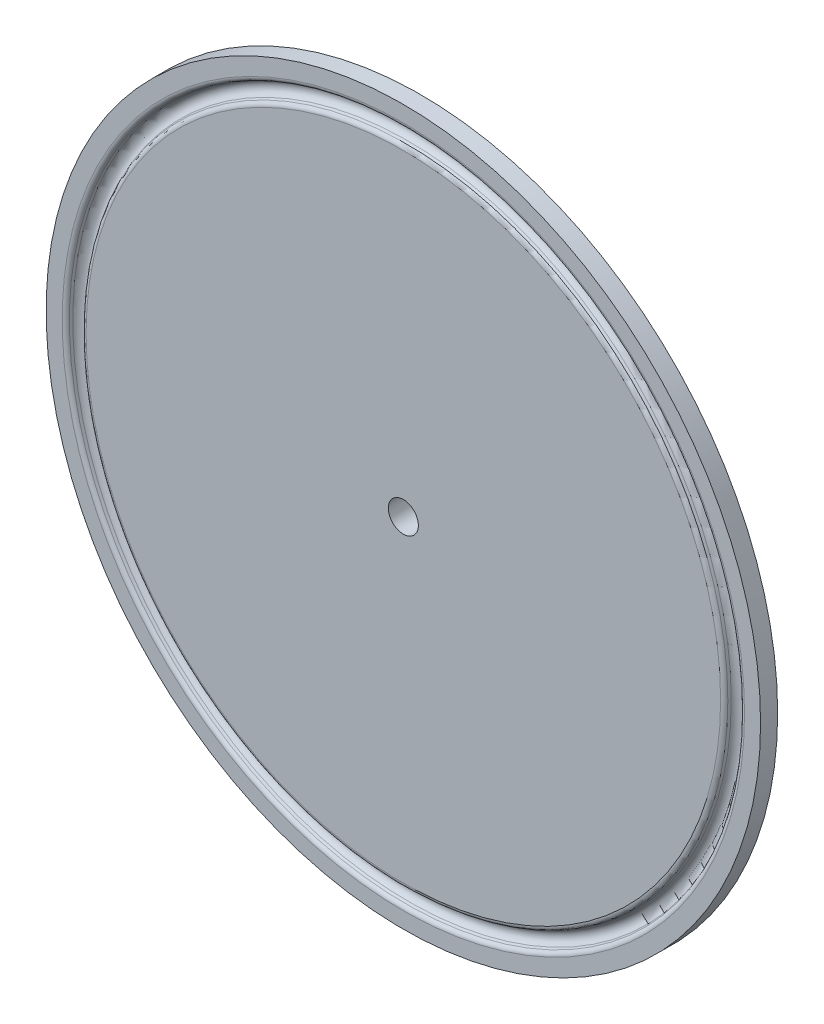
ISO-10303-21;
HEADER;
FILE_DESCRIPTION(('STEP AP214'),'2;1');
FILE_NAME('part.step','',(''),(''),'','','');
FILE_SCHEMA(('AUTOMOTIVE_DESIGN { 1 0 10303 214 1 1 1 1 }'));
ENDSEC;
DATA;
#1=APPLICATION_CONTEXT('core data for automotive mechanical design processes');
#2=APPLICATION_PROTOCOL_DEFINITION('international standard','automotive_design',2000,#1);
#3=PRODUCT_CONTEXT('',#1,'mechanical');
#4=PRODUCT('Part','Part','',(#3));
#5=PRODUCT_RELATED_PRODUCT_CATEGORY('part','',(#4));
#6=PRODUCT_DEFINITION_FORMATION('','',#4);
#7=PRODUCT_DEFINITION_CONTEXT('part definition',#1,'design');
#8=PRODUCT_DEFINITION('design','',#6,#7);
#9=PRODUCT_DEFINITION_SHAPE('','',#8);
#10=(LENGTH_UNIT() NAMED_UNIT(*) SI_UNIT(.MILLI.,.METRE.));
#11=(NAMED_UNIT(*) PLANE_ANGLE_UNIT() SI_UNIT($,.RADIAN.));
#12=(NAMED_UNIT(*) SI_UNIT($,.STERADIAN.) SOLID_ANGLE_UNIT());
#13=UNCERTAINTY_MEASURE_WITH_UNIT(LENGTH_MEASURE(1.E-05),#10,'distance_accuracy_value','');
#14=(GEOMETRIC_REPRESENTATION_CONTEXT(3) GLOBAL_UNCERTAINTY_ASSIGNED_CONTEXT((#13)) GLOBAL_UNIT_ASSIGNED_CONTEXT((#10,
#11,#12)) REPRESENTATION_CONTEXT('',''));
#15=CARTESIAN_POINT('',(0.,0.,0.));
#16=DIRECTION('',(0.,0.,1.));
#17=DIRECTION('',(1.,0.,0.));
#18=AXIS2_PLACEMENT_3D('',#15,#16,#17);
#19=CARTESIAN_POINT('',(0.,45.5042147091706,-7.9248));
#20=DIRECTION('',(0.,0.,1.));
#21=DIRECTION('',(1.,0.,0.));
#22=AXIS2_PLACEMENT_3D('',#19,#20,#21);
#23=PLANE('',#22);
#24=CARTESIAN_POINT('',(0.,0.,-7.9248));
#25=DIRECTION('',(0.,0.,1.));
#26=DIRECTION('',(1.,0.,0.));
#27=AXIS2_PLACEMENT_3D('',#24,#25,#26);
#28=CIRCLE('',#27,5.5);
#29=CARTESIAN_POINT('',(5.5,0.,-7.9248));
#30=VERTEX_POINT('',#29);
#31=EDGE_CURVE('E10',#30,#30,#28,.T.);
#32=ORIENTED_EDGE('',*,*,#31,.T.);
#33=EDGE_LOOP('',(#32));
#34=FACE_BOUND('',#33,.T.);
#35=CARTESIAN_POINT('',(0.,0.,-7.9248));
#36=DIRECTION('',(0.,0.,1.));
#37=DIRECTION('',(1.,0.,0.));
#38=AXIS2_PLACEMENT_3D('',#35,#36,#37);
#39=CIRCLE('',#38,45.5042147091706);
#40=CARTESIAN_POINT('',(45.5042147091706,0.,-7.9248));
#41=VERTEX_POINT('',#40);
#42=EDGE_CURVE('E54',#41,#41,#39,.T.);
#43=ORIENTED_EDGE('',*,*,#42,.F.);
#44=EDGE_LOOP('',(#43));
#45=FACE_BOUND('',#44,.T.);
#46=ADVANCED_FACE('F41',(#34,#45),#23,.F.);
#47=CARTESIAN_POINT('',(0.,0.,-7.9248));
#48=DIRECTION('',(0.,0.,1.));
#49=DIRECTION('',(1.,0.,0.));
#50=AXIS2_PLACEMENT_3D('',#47,#48,#49);
#51=CONICAL_SURFACE('',#50,45.5042147091706,1.22173047639603);
#52=CARTESIAN_POINT('',(0.,0.,-2.8448));
#53=DIRECTION('',(0.,0.,1.));
#54=DIRECTION('',(1.,0.,0.));
#55=AXIS2_PLACEMENT_3D('',#52,#53,#54);
#56=CIRCLE('',#55,59.4614);
#57=CARTESIAN_POINT('',(59.4614,0.,-2.8448));
#58=VERTEX_POINT('',#57);
#59=EDGE_CURVE('E59',#58,#58,#56,.T.);
#60=ORIENTED_EDGE('',*,*,#59,.F.);
#61=EDGE_LOOP('',(#60));
#62=FACE_BOUND('',#61,.T.);
#63=ORIENTED_EDGE('',*,*,#42,.T.);
#64=EDGE_LOOP('',(#63));
#65=FACE_BOUND('',#64,.T.);
#66=ADVANCED_FACE('F123',(#62,#65),#51,.T.);
#67=CARTESIAN_POINT('',(0.,0.,0.));
#68=DIRECTION('',(0.,0.,1.));
#69=DIRECTION('',(1.,0.,0.));
#70=AXIS2_PLACEMENT_3D('',#67,#68,#69);
#71=CYLINDRICAL_SURFACE('',#70,59.4614);
#72=CARTESIAN_POINT('',(0.,0.,0.));
#73=DIRECTION('',(0.,0.,1.));
#74=DIRECTION('',(1.,0.,0.));
#75=AXIS2_PLACEMENT_3D('',#72,#73,#74);
#76=CIRCLE('',#75,59.4614);
#77=CARTESIAN_POINT('',(59.4614,0.,0.));
#78=VERTEX_POINT('',#77);
#79=EDGE_CURVE('E65',#78,#78,#76,.T.);
#80=ORIENTED_EDGE('',*,*,#79,.F.);
#81=EDGE_LOOP('',(#80));
#82=FACE_BOUND('',#81,.T.);
#83=ORIENTED_EDGE('',*,*,#59,.T.);
#84=EDGE_LOOP('',(#83));
#85=FACE_BOUND('',#84,.T.);
#86=ADVANCED_FACE('F127',(#82,#85),#71,.T.);
#87=CARTESIAN_POINT('',(0.,56.7910722747395,0.));
#88=DIRECTION('',(0.,0.,-1.));
#89=DIRECTION('',(-1.,0.,0.));
#90=AXIS2_PLACEMENT_3D('',#87,#88,#89);
#91=PLANE('',#90);
#92=CARTESIAN_POINT('',(0.,0.,0.));
#93=DIRECTION('',(0.,0.,1.));
#94=DIRECTION('',(1.,0.,0.));
#95=AXIS2_PLACEMENT_3D('',#92,#93,#94);
#96=CIRCLE('',#95,56.7910722747395);
#97=CARTESIAN_POINT('',(56.7910722747395,0.,0.));
#98=VERTEX_POINT('',#97);
#99=EDGE_CURVE('E69',#98,#98,#96,.T.);
#100=ORIENTED_EDGE('',*,*,#99,.F.);
#101=EDGE_LOOP('',(#100));
#102=FACE_BOUND('',#101,.T.);
#103=ORIENTED_EDGE('',*,*,#79,.T.);
#104=EDGE_LOOP('',(#103));
#105=FACE_BOUND('',#104,.T.);
#106=ADVANCED_FACE('F134',(#102,#105),#91,.F.);
#107=CARTESIAN_POINT('',(0.,0.,-0.7874));
#108=DIRECTION('',(0.,0.,1.));
#109=DIRECTION('',(1.,0.,0.));
#110=AXIS2_PLACEMENT_3D('',#107,#108,#109);
#111=TOROIDAL_SURFACE('',#110,56.7910722747395,0.7874);
#112=CARTESIAN_POINT('',(0.,0.,-0.479738309427547));
#113=DIRECTION('',(0.,0.,1.));
#114=DIRECTION('',(1.,0.,0.));
#115=AXIS2_PLACEMENT_3D('',#112,#113,#114);
#116=CIRCLE('',#115,56.0662667531311);
#117=CARTESIAN_POINT('',(56.0662667531311,0.,-0.479738309427547));
#118=VERTEX_POINT('',#117);
#119=EDGE_CURVE('E73',#118,#118,#116,.T.);
#120=ORIENTED_EDGE('',*,*,#119,.F.);
#121=EDGE_LOOP('',(#120));
#122=FACE_BOUND('',#121,.T.);
#123=ORIENTED_EDGE('',*,*,#99,.T.);
#124=EDGE_LOOP('',(#123));
#125=FACE_BOUND('',#124,.T.);
#126=ADVANCED_FACE('F138',(#122,#125),#111,.T.);
#127=CARTESIAN_POINT('',(0.,0.,-0.479738309427547));
#128=DIRECTION('',(0.,0.,1.));
#129=DIRECTION('',(1.,0.,0.));
#130=AXIS2_PLACEMENT_3D('',#127,#128,#129);
#131=CONICAL_SURFACE('',#130,56.0662667531311,0.401425727958702);
#132=CARTESIAN_POINT('',(0.,0.,-0.872854821190493));
#133=DIRECTION('',(0.,0.,1.));
#134=DIRECTION('',(1.,0.,0.));
#135=AXIS2_PLACEMENT_3D('',#132,#133,#134);
#136=CIRCLE('',#135,55.8993986940515);
#137=CARTESIAN_POINT('',(55.8993986940515,0.,-0.872854821190493));
#138=VERTEX_POINT('',#137);
#139=EDGE_CURVE('E77',#138,#138,#136,.T.);
#140=ORIENTED_EDGE('',*,*,#139,.F.);
#141=EDGE_LOOP('',(#140));
#142=FACE_BOUND('',#141,.T.);
#143=ORIENTED_EDGE('',*,*,#119,.T.);
#144=EDGE_LOOP('',(#143));
#145=FACE_BOUND('',#144,.T.);
#146=ADVANCED_FACE('F142',(#142,#145),#131,.F.);
#147=CARTESIAN_POINT('',(0.,0.,-0.4064));
#148=DIRECTION('',(0.,0.,1.));
#149=DIRECTION('',(1.,0.,0.));
#150=AXIS2_PLACEMENT_3D('',#147,#148,#149);
#151=TOROIDAL_SURFACE('',#150,54.8005,1.1938);
#152=CARTESIAN_POINT('',(0.,0.,-0.872854821190503));
#153=DIRECTION('',(0.,0.,1.));
#154=DIRECTION('',(1.,0.,0.));
#155=AXIS2_PLACEMENT_3D('',#152,#153,#154);
#156=CIRCLE('',#155,53.7016013059485);
#157=CARTESIAN_POINT('',(53.7016013059485,0.,-0.872854821190503));
#158=VERTEX_POINT('',#157);
#159=EDGE_CURVE('E81',#158,#158,#156,.T.);
#160=ORIENTED_EDGE('',*,*,#159,.F.);
#161=EDGE_LOOP('',(#160));
#162=FACE_BOUND('',#161,.T.);
#163=ORIENTED_EDGE('',*,*,#139,.T.);
#164=EDGE_LOOP('',(#163));
#165=FACE_BOUND('',#164,.T.);
#166=ADVANCED_FACE('F146',(#162,#165),#151,.F.);
#167=CARTESIAN_POINT('',(0.,0.,-0.872854821190503));
#168=DIRECTION('',(0.,0.,-1.));
#169=DIRECTION('',(-1.,0.,0.));
#170=AXIS2_PLACEMENT_3D('',#167,#168,#169);
#171=CONICAL_SURFACE('',#170,53.7016013059485,0.401425727958718);
#172=CARTESIAN_POINT('',(0.,0.,-0.479738309427541));
#173=DIRECTION('',(0.,0.,1.));
#174=DIRECTION('',(1.,0.,0.));
#175=AXIS2_PLACEMENT_3D('',#172,#173,#174);
#176=CIRCLE('',#175,53.5347332468689);
#177=CARTESIAN_POINT('',(53.5347332468689,0.,-0.479738309427541));
#178=VERTEX_POINT('',#177);
#179=EDGE_CURVE('E85',#178,#178,#176,.T.);
#180=ORIENTED_EDGE('',*,*,#179,.F.);
#181=EDGE_LOOP('',(#180));
#182=FACE_BOUND('',#181,.T.);
#183=ORIENTED_EDGE('',*,*,#159,.T.);
#184=EDGE_LOOP('',(#183));
#185=FACE_BOUND('',#184,.T.);
#186=ADVANCED_FACE('F150',(#182,#185),#171,.T.);
#187=CARTESIAN_POINT('',(0.,0.,-0.7874));
#188=DIRECTION('',(0.,0.,1.));
#189=DIRECTION('',(1.,0.,0.));
#190=AXIS2_PLACEMENT_3D('',#187,#188,#189);
#191=TOROIDAL_SURFACE('',#190,52.8099277252605,0.787400000000005);
#192=CARTESIAN_POINT('',(0.,0.,0.));
#193=DIRECTION('',(0.,0.,1.));
#194=DIRECTION('',(1.,0.,0.));
#195=AXIS2_PLACEMENT_3D('',#192,#193,#194);
#196=CIRCLE('',#195,52.8099277252605);
#197=CARTESIAN_POINT('',(52.8099277252605,0.,0.));
#198=VERTEX_POINT('',#197);
#199=EDGE_CURVE('E89',#198,#198,#196,.T.);
#200=ORIENTED_EDGE('',*,*,#199,.F.);
#201=EDGE_LOOP('',(#200));
#202=FACE_BOUND('',#201,.T.);
#203=ORIENTED_EDGE('',*,*,#179,.T.);
#204=EDGE_LOOP('',(#203));
#205=FACE_BOUND('',#204,.T.);
#206=ADVANCED_FACE('F154',(#202,#205),#191,.T.);
#207=CARTESIAN_POINT('',(0.,0.,0.));
#208=DIRECTION('',(0.,0.,-1.));
#209=DIRECTION('',(-1.,0.,0.));
#210=AXIS2_PLACEMENT_3D('',#207,#208,#209);
#211=PLANE('',#210);
#212=CARTESIAN_POINT('',(0.,0.,0.));
#213=DIRECTION('',(0.,0.,-1.));
#214=DIRECTION('',(-1.,0.,0.));
#215=AXIS2_PLACEMENT_3D('',#212,#213,#214);
#216=CIRCLE('',#215,2.5);
#217=CARTESIAN_POINT('',(-2.5,0.,0.));
#218=VERTEX_POINT('',#217);
#219=EDGE_CURVE('E101',#218,#218,#216,.T.);
#220=ORIENTED_EDGE('',*,*,#219,.T.);
#221=EDGE_LOOP('',(#220));
#222=FACE_BOUND('',#221,.T.);
#223=ORIENTED_EDGE('',*,*,#199,.T.);
#224=EDGE_LOOP('',(#223));
#225=FACE_BOUND('',#224,.T.);
#226=ADVANCED_FACE('F106',(#222,#225),#211,.F.);
#227=CARTESIAN_POINT('',(0.,0.,-17.9248));
#228=DIRECTION('',(0.,0.,-1.));
#229=DIRECTION('',(-1.,0.,0.));
#230=AXIS2_PLACEMENT_3D('',#227,#228,#229);
#231=PLANE('',#230);
#232=CARTESIAN_POINT('',(0.,0.,-17.9248));
#233=DIRECTION('',(0.,0.,-1.));
#234=DIRECTION('',(-1.,0.,0.));
#235=AXIS2_PLACEMENT_3D('',#232,#233,#234);
#236=CIRCLE('',#235,3.5);
#237=CARTESIAN_POINT('',(-3.5,0.,-17.9248));
#238=VERTEX_POINT('',#237);
#239=EDGE_CURVE('E93',#238,#238,#236,.T.);
#240=ORIENTED_EDGE('',*,*,#239,.T.);
#241=EDGE_LOOP('',(#240));
#242=FACE_BOUND('',#241,.T.);
#243=CARTESIAN_POINT('',(0.,0.,-17.9248));
#244=DIRECTION('',(0.,0.,-1.));
#245=DIRECTION('',(-1.,0.,0.));
#246=AXIS2_PLACEMENT_3D('',#243,#244,#245);
#247=CIRCLE('',#246,2.5);
#248=CARTESIAN_POINT('',(-2.5,0.,-17.9248));
#249=VERTEX_POINT('',#248);
#250=EDGE_CURVE('E97',#249,#249,#247,.T.);
#251=ORIENTED_EDGE('',*,*,#250,.F.);
#252=EDGE_LOOP('',(#251));
#253=FACE_BOUND('',#252,.T.);
#254=ADVANCED_FACE('F119',(#242,#253),#231,.T.);
#255=CARTESIAN_POINT('',(0.,0.,-17.9248));
#256=DIRECTION('',(0.,0.,1.));
#257=DIRECTION('',(1.,0.,0.));
#258=AXIS2_PLACEMENT_3D('',#255,#256,#257);
#259=CYLINDRICAL_SURFACE('',#258,3.5);
#260=CARTESIAN_POINT('',(0.,0.,-9.9248));
#261=DIRECTION('',(0.,0.,1.));
#262=DIRECTION('',(1.,0.,0.));
#263=AXIS2_PLACEMENT_3D('',#260,#261,#262);
#264=CIRCLE('',#263,3.5);
#265=CARTESIAN_POINT('',(3.5,0.,-9.9248));
#266=VERTEX_POINT('',#265);
#267=EDGE_CURVE('E49',#266,#266,#264,.F.);
#268=ORIENTED_EDGE('',*,*,#267,.T.);
#269=EDGE_LOOP('',(#268));
#270=FACE_BOUND('',#269,.T.);
#271=ORIENTED_EDGE('',*,*,#239,.F.);
#272=EDGE_LOOP('',(#271));
#273=FACE_BOUND('',#272,.T.);
#274=ADVANCED_FACE('F111',(#270,#273),#259,.T.);
#275=CARTESIAN_POINT('',(0.,0.,-17.9248));
#276=DIRECTION('',(0.,0.,1.));
#277=DIRECTION('',(1.,0.,0.));
#278=AXIS2_PLACEMENT_3D('',#275,#276,#277);
#279=CYLINDRICAL_SURFACE('',#278,2.5);
#280=ORIENTED_EDGE('',*,*,#250,.T.);
#281=EDGE_LOOP('',(#280));
#282=FACE_BOUND('',#281,.T.);
#283=ORIENTED_EDGE('',*,*,#219,.F.);
#284=EDGE_LOOP('',(#283));
#285=FACE_BOUND('',#284,.T.);
#286=ADVANCED_FACE('F109',(#282,#285),#279,.F.);
#287=CARTESIAN_POINT('',(0.,0.,-9.9248));
#288=DIRECTION('',(0.,0.,1.));
#289=DIRECTION('',(1.,0.,0.));
#290=AXIS2_PLACEMENT_3D('',#287,#288,#289);
#291=TOROIDAL_SURFACE('',#290,5.5,2.);
#292=ORIENTED_EDGE('',*,*,#31,.F.);
#293=EDGE_LOOP('',(#292));
#294=FACE_BOUND('',#293,.T.);
#295=ORIENTED_EDGE('',*,*,#267,.F.);
#296=EDGE_LOOP('',(#295));
#297=FACE_BOUND('',#296,.T.);
#298=ADVANCED_FACE('F43',(#294,#297),#291,.F.);
#299=CLOSED_SHELL('',(#46,#66,#86,#106,#126,#146,#166,#186,#206,#226,#254,#274,#286,#298));
#300=MANIFOLD_SOLID_BREP('B2',#299);
#301=ADVANCED_BREP_SHAPE_REPRESENTATION('',(#18,#300),#14);
#302=SHAPE_DEFINITION_REPRESENTATION(#9,#301);
ENDSEC;
END-ISO-10303-21;
